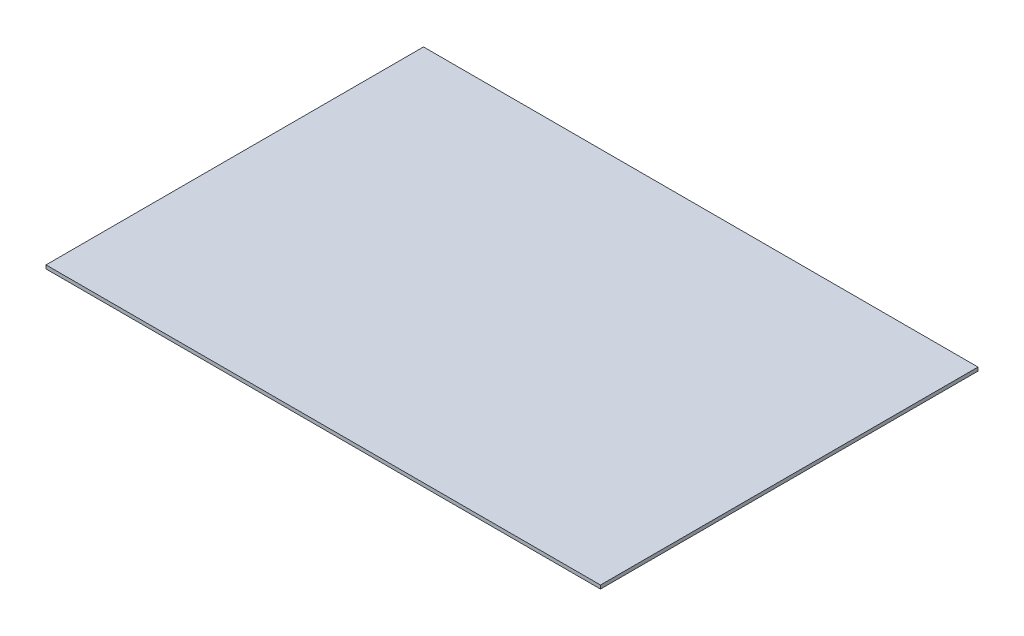
ISO-10303-21;
HEADER;
FILE_DESCRIPTION(('STEP AP214'),'2;1');
FILE_NAME('part.step','',(''),(''),'','','');
FILE_SCHEMA(('AUTOMOTIVE_DESIGN { 1 0 10303 214 1 1 1 1 }'));
ENDSEC;
DATA;
#1=APPLICATION_CONTEXT('core data for automotive mechanical design processes');
#2=APPLICATION_PROTOCOL_DEFINITION('international standard','automotive_design',2000,#1);
#3=PRODUCT_CONTEXT('',#1,'mechanical');
#4=PRODUCT('Part','Part','',(#3));
#5=PRODUCT_RELATED_PRODUCT_CATEGORY('part','',(#4));
#6=PRODUCT_DEFINITION_FORMATION('','',#4);
#7=PRODUCT_DEFINITION_CONTEXT('part definition',#1,'design');
#8=PRODUCT_DEFINITION('design','',#6,#7);
#9=PRODUCT_DEFINITION_SHAPE('','',#8);
#10=(LENGTH_UNIT() NAMED_UNIT(*) SI_UNIT(.MILLI.,.METRE.));
#11=(NAMED_UNIT(*) PLANE_ANGLE_UNIT() SI_UNIT($,.RADIAN.));
#12=(NAMED_UNIT(*) SI_UNIT($,.STERADIAN.) SOLID_ANGLE_UNIT());
#13=UNCERTAINTY_MEASURE_WITH_UNIT(LENGTH_MEASURE(1.E-05),#10,'distance_accuracy_value','');
#14=(GEOMETRIC_REPRESENTATION_CONTEXT(3) GLOBAL_UNCERTAINTY_ASSIGNED_CONTEXT((#13)) GLOBAL_UNIT_ASSIGNED_CONTEXT((#10,
#11,#12)) REPRESENTATION_CONTEXT('',''));
#15=CARTESIAN_POINT('',(0.,0.,0.));
#16=DIRECTION('',(0.,0.,1.));
#17=DIRECTION('',(1.,0.,0.));
#18=AXIS2_PLACEMENT_3D('',#15,#16,#17);
#19=CARTESIAN_POINT('',(0.,6.,0.));
#20=DIRECTION('',(1.,0.,0.));
#21=DIRECTION('',(0.,0.,-1.));
#22=AXIS2_PLACEMENT_3D('',#19,#20,#21);
#23=PLANE('',#22);
#24=DIRECTION('',(0.,0.,1.));
#25=VECTOR('',#24,1.);
#26=CARTESIAN_POINT('',(0.,0.,0.));
#27=LINE('',#26,#25);
#28=CARTESIAN_POINT('',(0.,0.,-640.));
#29=VERTEX_POINT('',#28);
#30=CARTESIAN_POINT('',(0.,0.,0.));
#31=VERTEX_POINT('',#30);
#32=EDGE_CURVE('E96',#29,#31,#27,.T.);
#33=ORIENTED_EDGE('',*,*,#32,.T.);
#34=DIRECTION('',(0.,-1.,0.));
#35=VECTOR('',#34,1.);
#36=CARTESIAN_POINT('',(0.,6.,0.));
#37=LINE('',#36,#35);
#38=CARTESIAN_POINT('',(0.,6.,0.));
#39=VERTEX_POINT('',#38);
#40=EDGE_CURVE('E11',#39,#31,#37,.T.);
#41=ORIENTED_EDGE('',*,*,#40,.F.);
#42=DIRECTION('',(0.,0.,1.));
#43=VECTOR('',#42,1.);
#44=CARTESIAN_POINT('',(0.,6.,0.));
#45=LINE('',#44,#43);
#46=CARTESIAN_POINT('',(0.,6.,-640.));
#47=VERTEX_POINT('',#46);
#48=EDGE_CURVE('E84',#47,#39,#45,.T.);
#49=ORIENTED_EDGE('',*,*,#48,.F.);
#50=DIRECTION('',(0.,-1.,0.));
#51=VECTOR('',#50,1.);
#52=CARTESIAN_POINT('',(0.,6.,-640.));
#53=LINE('',#52,#51);
#54=EDGE_CURVE('E92',#47,#29,#53,.T.);
#55=ORIENTED_EDGE('',*,*,#54,.T.);
#56=EDGE_LOOP('',(#33,#41,#49,#55));
#57=FACE_BOUND('',#56,.T.);
#58=ADVANCED_FACE('F33',(#57),#23,.F.);
#59=CARTESIAN_POINT('',(0.,6.,0.));
#60=DIRECTION('',(0.,0.,-1.));
#61=DIRECTION('',(-1.,0.,0.));
#62=AXIS2_PLACEMENT_3D('',#59,#60,#61);
#63=PLANE('',#62);
#64=DIRECTION('',(1.,0.,0.));
#65=VECTOR('',#64,1.);
#66=CARTESIAN_POINT('',(0.,0.,0.));
#67=LINE('',#66,#65);
#68=CARTESIAN_POINT('',(940.,0.,0.));
#69=VERTEX_POINT('',#68);
#70=EDGE_CURVE('E88',#31,#69,#67,.T.);
#71=ORIENTED_EDGE('',*,*,#70,.T.);
#72=DIRECTION('',(0.,-1.,0.));
#73=VECTOR('',#72,1.);
#74=CARTESIAN_POINT('',(940.,6.,0.));
#75=LINE('',#74,#73);
#76=CARTESIAN_POINT('',(940.,6.,0.));
#77=VERTEX_POINT('',#76);
#78=EDGE_CURVE('E41',#77,#69,#75,.T.);
#79=ORIENTED_EDGE('',*,*,#78,.F.);
#80=DIRECTION('',(1.,0.,0.));
#81=VECTOR('',#80,1.);
#82=CARTESIAN_POINT('',(0.,6.,0.));
#83=LINE('',#82,#81);
#84=EDGE_CURVE('E79',#39,#77,#83,.T.);
#85=ORIENTED_EDGE('',*,*,#84,.F.);
#86=ORIENTED_EDGE('',*,*,#40,.T.);
#87=EDGE_LOOP('',(#71,#79,#85,#86));
#88=FACE_BOUND('',#87,.T.);
#89=ADVANCED_FACE('F87',(#88),#63,.F.);
#90=CARTESIAN_POINT('',(940.,6.,0.));
#91=DIRECTION('',(-1.,0.,0.));
#92=DIRECTION('',(0.,0.,1.));
#93=AXIS2_PLACEMENT_3D('',#90,#91,#92);
#94=PLANE('',#93);
#95=DIRECTION('',(0.,0.,-1.));
#96=VECTOR('',#95,1.);
#97=CARTESIAN_POINT('',(940.,0.,0.));
#98=LINE('',#97,#96);
#99=CARTESIAN_POINT('',(940.,0.,-640.));
#100=VERTEX_POINT('',#99);
#101=EDGE_CURVE('E66',#69,#100,#98,.T.);
#102=ORIENTED_EDGE('',*,*,#101,.T.);
#103=DIRECTION('',(0.,-1.,0.));
#104=VECTOR('',#103,1.);
#105=CARTESIAN_POINT('',(940.,6.,-640.));
#106=LINE('',#105,#104);
#107=CARTESIAN_POINT('',(940.,6.,-640.));
#108=VERTEX_POINT('',#107);
#109=EDGE_CURVE('E89',#108,#100,#106,.T.);
#110=ORIENTED_EDGE('',*,*,#109,.F.);
#111=DIRECTION('',(0.,0.,-1.));
#112=VECTOR('',#111,1.);
#113=CARTESIAN_POINT('',(940.,6.,0.));
#114=LINE('',#113,#112);
#115=EDGE_CURVE('E82',#77,#108,#114,.T.);
#116=ORIENTED_EDGE('',*,*,#115,.F.);
#117=ORIENTED_EDGE('',*,*,#78,.T.);
#118=EDGE_LOOP('',(#102,#110,#116,#117));
#119=FACE_BOUND('',#118,.T.);
#120=ADVANCED_FACE('F90',(#119),#94,.F.);
#121=CARTESIAN_POINT('',(0.,6.,-640.));
#122=DIRECTION('',(0.,0.,1.));
#123=DIRECTION('',(1.,0.,0.));
#124=AXIS2_PLACEMENT_3D('',#121,#122,#123);
#125=PLANE('',#124);
#126=DIRECTION('',(-1.,0.,0.));
#127=VECTOR('',#126,1.);
#128=CARTESIAN_POINT('',(0.,0.,-640.));
#129=LINE('',#128,#127);
#130=EDGE_CURVE('E72',#100,#29,#129,.T.);
#131=ORIENTED_EDGE('',*,*,#130,.T.);
#132=ORIENTED_EDGE('',*,*,#54,.F.);
#133=DIRECTION('',(-1.,0.,0.));
#134=VECTOR('',#133,1.);
#135=CARTESIAN_POINT('',(0.,6.,-640.));
#136=LINE('',#135,#134);
#137=EDGE_CURVE('E49',#108,#47,#136,.T.);
#138=ORIENTED_EDGE('',*,*,#137,.F.);
#139=ORIENTED_EDGE('',*,*,#109,.T.);
#140=EDGE_LOOP('',(#131,#132,#138,#139));
#141=FACE_BOUND('',#140,.T.);
#142=ADVANCED_FACE('F103',(#141),#125,.F.);
#143=CARTESIAN_POINT('',(0.,6.,0.));
#144=DIRECTION('',(0.,-1.,0.));
#145=DIRECTION('',(0.,0.,-1.));
#146=AXIS2_PLACEMENT_3D('',#143,#144,#145);
#147=PLANE('',#146);
#148=ORIENTED_EDGE('',*,*,#48,.T.);
#149=ORIENTED_EDGE('',*,*,#84,.T.);
#150=ORIENTED_EDGE('',*,*,#115,.T.);
#151=ORIENTED_EDGE('',*,*,#137,.T.);
#152=EDGE_LOOP('',(#148,#149,#150,#151));
#153=FACE_BOUND('',#152,.T.);
#154=ADVANCED_FACE('F80',(#153),#147,.F.);
#155=CARTESIAN_POINT('',(0.,0.,0.));
#156=DIRECTION('',(0.,-1.,0.));
#157=DIRECTION('',(0.,0.,-1.));
#158=AXIS2_PLACEMENT_3D('',#155,#156,#157);
#159=PLANE('',#158);
#160=ORIENTED_EDGE('',*,*,#32,.F.);
#161=ORIENTED_EDGE('',*,*,#130,.F.);
#162=ORIENTED_EDGE('',*,*,#101,.F.);
#163=ORIENTED_EDGE('',*,*,#70,.F.);
#164=EDGE_LOOP('',(#160,#161,#162,#163));
#165=FACE_BOUND('',#164,.T.);
#166=ADVANCED_FACE('F106',(#165),#159,.T.);
#167=CLOSED_SHELL('',(#58,#89,#120,#142,#154,#166));
#168=MANIFOLD_SOLID_BREP('B2',#167);
#169=ADVANCED_BREP_SHAPE_REPRESENTATION('',(#18,#168),#14);
#170=SHAPE_DEFINITION_REPRESENTATION(#9,#169);
ENDSEC;
END-ISO-10303-21;
